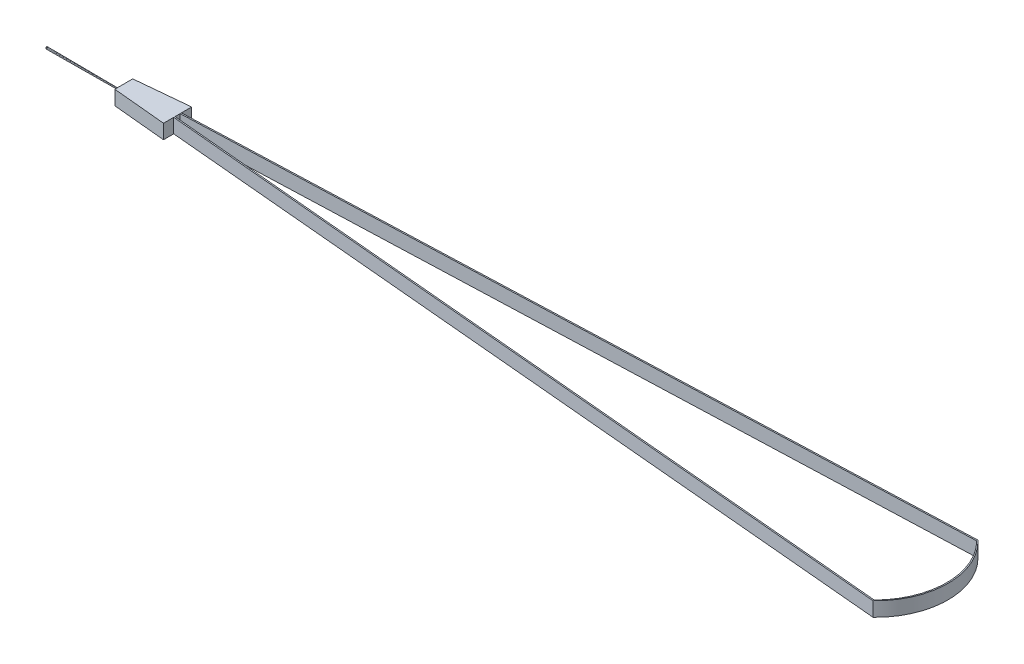
ISO-10303-21;
HEADER;
FILE_DESCRIPTION(('STEP AP214'),'2;1');
FILE_NAME('part.step','',(''),(''),'','','');
FILE_SCHEMA(('AUTOMOTIVE_DESIGN { 1 0 10303 214 1 1 1 1 }'));
ENDSEC;
DATA;
#1=APPLICATION_CONTEXT('core data for automotive mechanical design processes');
#2=APPLICATION_PROTOCOL_DEFINITION('international standard','automotive_design',2000,#1);
#3=PRODUCT_CONTEXT('',#1,'mechanical');
#4=PRODUCT('Part','Part','',(#3));
#5=PRODUCT_RELATED_PRODUCT_CATEGORY('part','',(#4));
#6=PRODUCT_DEFINITION_FORMATION('','',#4);
#7=PRODUCT_DEFINITION_CONTEXT('part definition',#1,'design');
#8=PRODUCT_DEFINITION('design','',#6,#7);
#9=PRODUCT_DEFINITION_SHAPE('','',#8);
#10=(LENGTH_UNIT() NAMED_UNIT(*) SI_UNIT(.MILLI.,.METRE.));
#11=(NAMED_UNIT(*) PLANE_ANGLE_UNIT() SI_UNIT($,.RADIAN.));
#12=(NAMED_UNIT(*) SI_UNIT($,.STERADIAN.) SOLID_ANGLE_UNIT());
#13=UNCERTAINTY_MEASURE_WITH_UNIT(LENGTH_MEASURE(1.E-05),#10,'distance_accuracy_value','');
#14=(GEOMETRIC_REPRESENTATION_CONTEXT(3) GLOBAL_UNCERTAINTY_ASSIGNED_CONTEXT((#13)) GLOBAL_UNIT_ASSIGNED_CONTEXT((#10,
#11,#12)) REPRESENTATION_CONTEXT('',''));
#15=CARTESIAN_POINT('',(0.,0.,0.));
#16=DIRECTION('',(0.,0.,1.));
#17=DIRECTION('',(1.,0.,0.));
#18=AXIS2_PLACEMENT_3D('',#15,#16,#17);
#19=CARTESIAN_POINT('',(0.221152593945903,0.,-2.46121703668856));
#20=DIRECTION('',(-0.0894944155506228,0.,0.995987324008319));
#21=DIRECTION('',(0.995987324008319,0.,0.0894944155506228));
#22=AXIS2_PLACEMENT_3D('',#19,#20,#21);
#23=PLANE('',#22);
#24=DIRECTION('',(0.995987324008319,0.,0.0894944155506228));
#25=VECTOR('',#24,1.);
#26=CARTESIAN_POINT('',(0.221152593945903,5.6,-2.46121703668856));
#27=LINE('',#26,#25);
#28=CARTESIAN_POINT('',(10.9064516129032,5.6,-1.50108976635671));
#29=VERTEX_POINT('',#28);
#30=CARTESIAN_POINT('',(310.906451612903,5.6,25.4554025684419));
#31=VERTEX_POINT('',#30);
#32=EDGE_CURVE('E215',#29,#31,#27,.T.);
#33=ORIENTED_EDGE('',*,*,#32,.F.);
#34=DIRECTION('',(0.,1.,0.));
#35=VECTOR('',#34,1.);
#36=CARTESIAN_POINT('',(10.9064516129032,0.,-1.50108976635671));
#37=LINE('',#36,#35);
#38=CARTESIAN_POINT('',(10.9064516129032,0.,-1.50108976635671));
#39=VERTEX_POINT('',#38);
#40=EDGE_CURVE('E13',#39,#29,#37,.T.);
#41=ORIENTED_EDGE('',*,*,#40,.F.);
#42=DIRECTION('',(0.995987324008319,0.,0.0894944155506228));
#43=VECTOR('',#42,1.);
#44=CARTESIAN_POINT('',(0.221152593945903,0.,-2.46121703668856));
#45=LINE('',#44,#43);
#46=CARTESIAN_POINT('',(310.906451612903,0.,25.4554025684419));
#47=VERTEX_POINT('',#46);
#48=EDGE_CURVE('E241',#39,#47,#45,.T.);
#49=ORIENTED_EDGE('',*,*,#48,.T.);
#50=DIRECTION('',(0.,1.,0.));
#51=VECTOR('',#50,1.);
#52=CARTESIAN_POINT('',(310.906451612903,0.,25.4554025684419));
#53=LINE('',#52,#51);
#54=EDGE_CURVE('E114',#47,#31,#53,.T.);
#55=ORIENTED_EDGE('',*,*,#54,.T.);
#56=EDGE_LOOP('',(#33,#41,#49,#55));
#57=FACE_BOUND('',#56,.T.);
#58=ADVANCED_FACE('F111',(#57),#23,.T.);
#59=CARTESIAN_POINT('',(10.9064516129032,0.,0.));
#60=DIRECTION('',(1.,0.,0.));
#61=DIRECTION('',(0.,0.,-1.));
#62=AXIS2_PLACEMENT_3D('',#59,#60,#61);
#63=PLANE('',#62);
#64=DIRECTION('',(0.,0.,-1.));
#65=VECTOR('',#64,1.);
#66=CARTESIAN_POINT('',(10.9064516129032,5.6,0.));
#67=LINE('',#66,#65);
#68=CARTESIAN_POINT('',(10.9064516129032,5.6,-2.00322580645161));
#69=VERTEX_POINT('',#68);
#70=EDGE_CURVE('E239',#29,#69,#67,.T.);
#71=ORIENTED_EDGE('',*,*,#70,.T.);
#72=DIRECTION('',(0.,1.,0.));
#73=VECTOR('',#72,1.);
#74=CARTESIAN_POINT('',(10.9064516129032,0.,-2.00322580645161));
#75=LINE('',#74,#73);
#76=CARTESIAN_POINT('',(10.9064516129032,0.,-2.00322580645161));
#77=VERTEX_POINT('',#76);
#78=EDGE_CURVE('E121',#77,#69,#75,.T.);
#79=ORIENTED_EDGE('',*,*,#78,.F.);
#80=DIRECTION('',(0.,0.,-1.));
#81=VECTOR('',#80,1.);
#82=CARTESIAN_POINT('',(10.9064516129032,0.,0.));
#83=LINE('',#82,#81);
#84=EDGE_CURVE('E201',#39,#77,#83,.T.);
#85=ORIENTED_EDGE('',*,*,#84,.F.);
#86=ORIENTED_EDGE('',*,*,#40,.T.);
#87=EDGE_LOOP('',(#71,#79,#85,#86));
#88=FACE_BOUND('',#87,.T.);
#89=ADVANCED_FACE('F261',(#88),#63,.F.);
#90=CARTESIAN_POINT('',(0.265938297905476,0.,-2.95940462037539));
#91=DIRECTION('',(0.0895014503086832,0.,-0.995986691875269));
#92=DIRECTION('',(-0.995986691875269,0.,-0.0895014503086832));
#93=AXIS2_PLACEMENT_3D('',#90,#91,#92);
#94=PLANE('',#93);
#95=DIRECTION('',(-0.995986691875269,0.,-0.0895014503086832));
#96=VECTOR('',#95,1.);
#97=CARTESIAN_POINT('',(0.265938297905476,5.6,-2.95940462037539));
#98=LINE('',#97,#96);
#99=CARTESIAN_POINT('',(310.906451612903,5.6,24.9554025684419));
#100=VERTEX_POINT('',#99);
#101=EDGE_CURVE('E186',#100,#69,#98,.T.);
#102=ORIENTED_EDGE('',*,*,#101,.F.);
#103=DIRECTION('',(0.,1.,0.));
#104=VECTOR('',#103,1.);
#105=CARTESIAN_POINT('',(310.906451612903,0.,24.9554025684419));
#106=LINE('',#105,#104);
#107=CARTESIAN_POINT('',(310.906451612903,0.,24.9554025684419));
#108=VERTEX_POINT('',#107);
#109=EDGE_CURVE('E181',#108,#100,#106,.T.);
#110=ORIENTED_EDGE('',*,*,#109,.F.);
#111=DIRECTION('',(-0.995986691875269,0.,-0.0895014503086832));
#112=VECTOR('',#111,1.);
#113=CARTESIAN_POINT('',(0.265938297905476,0.,-2.95940462037539));
#114=LINE('',#113,#112);
#115=EDGE_CURVE('E184',#108,#77,#114,.T.);
#116=ORIENTED_EDGE('',*,*,#115,.T.);
#117=ORIENTED_EDGE('',*,*,#78,.T.);
#118=EDGE_LOOP('',(#102,#110,#116,#117));
#119=FACE_BOUND('',#118,.T.);
#120=ADVANCED_FACE('F183',(#119),#94,.T.);
#121=CARTESIAN_POINT('',(290.906451612903,0.,4.95540256844191));
#122=DIRECTION('',(0.,1.,0.));
#123=DIRECTION('',(0.,0.,1.));
#124=AXIS2_PLACEMENT_3D('',#121,#122,#123);
#125=CYLINDRICAL_SURFACE('',#124,28.284271247462);
#126=CARTESIAN_POINT('',(290.906451612903,5.6,4.95540256844191));
#127=DIRECTION('',(0.,1.,0.));
#128=DIRECTION('',(0.,0.,1.));
#129=AXIS2_PLACEMENT_3D('',#126,#127,#128);
#130=CIRCLE('',#129,28.284271247462);
#131=CARTESIAN_POINT('',(310.906451612903,5.6,-15.0445974315581));
#132=VERTEX_POINT('',#131);
#133=EDGE_CURVE('E234',#132,#100,#130,.F.);
#134=ORIENTED_EDGE('',*,*,#133,.F.);
#135=DIRECTION('',(0.,1.,0.));
#136=VECTOR('',#135,1.);
#137=CARTESIAN_POINT('',(310.906451612903,0.,-15.0445974315581));
#138=LINE('',#137,#136);
#139=CARTESIAN_POINT('',(310.906451612903,0.,-15.0445974315581));
#140=VERTEX_POINT('',#139);
#141=EDGE_CURVE('E192',#140,#132,#138,.T.);
#142=ORIENTED_EDGE('',*,*,#141,.F.);
#143=CARTESIAN_POINT('',(290.906451612903,0.,4.95540256844191));
#144=DIRECTION('',(0.,1.,0.));
#145=DIRECTION('',(0.,0.,1.));
#146=AXIS2_PLACEMENT_3D('',#143,#144,#145);
#147=CIRCLE('',#146,28.284271247462);
#148=EDGE_CURVE('E199',#140,#108,#147,.F.);
#149=ORIENTED_EDGE('',*,*,#148,.T.);
#150=ORIENTED_EDGE('',*,*,#109,.T.);
#151=EDGE_LOOP('',(#134,#142,#149,#150));
#152=FACE_BOUND('',#151,.T.);
#153=ADVANCED_FACE('F204',(#152),#125,.F.);
#154=CARTESIAN_POINT('',(-0.132384065074162,0.,-3.59694618302151));
#155=DIRECTION('',(0.03677967007489,0.,0.999323399040162));
#156=DIRECTION('',(0.999323399040162,0.,-0.03677967007489));
#157=AXIS2_PLACEMENT_3D('',#154,#155,#156);
#158=PLANE('',#157);
#159=DIRECTION('',(0.999323399040162,0.,-0.03677967007489));
#160=VECTOR('',#159,1.);
#161=CARTESIAN_POINT('',(-0.132384065074162,5.6,-3.59694618302151));
#162=LINE('',#161,#160);
#163=CARTESIAN_POINT('',(10.9064516129032,5.6,-4.00322580645162));
#164=VERTEX_POINT('',#163);
#165=EDGE_CURVE('E230',#164,#132,#162,.T.);
#166=ORIENTED_EDGE('',*,*,#165,.F.);
#167=DIRECTION('',(0.,1.,0.));
#168=VECTOR('',#167,1.);
#169=CARTESIAN_POINT('',(10.9064516129032,0.,-4.00322580645162));
#170=LINE('',#169,#168);
#171=CARTESIAN_POINT('',(10.9064516129032,0.,-4.00322580645162));
#172=VERTEX_POINT('',#171);
#173=EDGE_CURVE('E247',#172,#164,#170,.T.);
#174=ORIENTED_EDGE('',*,*,#173,.F.);
#175=DIRECTION('',(0.999323399040162,0.,-0.03677967007489));
#176=VECTOR('',#175,1.);
#177=CARTESIAN_POINT('',(-0.132384065074162,0.,-3.59694618302151));
#178=LINE('',#177,#176);
#179=EDGE_CURVE('E206',#172,#140,#178,.T.);
#180=ORIENTED_EDGE('',*,*,#179,.T.);
#181=ORIENTED_EDGE('',*,*,#141,.T.);
#182=EDGE_LOOP('',(#166,#174,#180,#181));
#183=FACE_BOUND('',#182,.T.);
#184=ADVANCED_FACE('F281',(#183),#158,.T.);
#185=CARTESIAN_POINT('',(10.9064516129032,0.,0.));
#186=DIRECTION('',(1.,0.,0.));
#187=DIRECTION('',(0.,0.,-1.));
#188=AXIS2_PLACEMENT_3D('',#185,#186,#187);
#189=PLANE('',#188);
#190=DIRECTION('',(0.,0.,-1.));
#191=VECTOR('',#190,1.);
#192=CARTESIAN_POINT('',(10.9064516129032,5.6,0.));
#193=LINE('',#192,#191);
#194=CARTESIAN_POINT('',(10.9064516129032,5.6,-4.50322580645162));
#195=VERTEX_POINT('',#194);
#196=EDGE_CURVE('E227',#164,#195,#193,.T.);
#197=ORIENTED_EDGE('',*,*,#196,.T.);
#198=DIRECTION('',(0.,1.,0.));
#199=VECTOR('',#198,1.);
#200=CARTESIAN_POINT('',(10.9064516129032,0.,-4.50322580645162));
#201=LINE('',#200,#199);
#202=CARTESIAN_POINT('',(10.9064516129032,0.,-4.50322580645162));
#203=VERTEX_POINT('',#202);
#204=EDGE_CURVE('E250',#203,#195,#201,.T.);
#205=ORIENTED_EDGE('',*,*,#204,.F.);
#206=DIRECTION('',(0.,0.,-1.));
#207=VECTOR('',#206,1.);
#208=CARTESIAN_POINT('',(10.9064516129032,0.,0.));
#209=LINE('',#208,#207);
#210=EDGE_CURVE('E209',#172,#203,#209,.T.);
#211=ORIENTED_EDGE('',*,*,#210,.F.);
#212=ORIENTED_EDGE('',*,*,#173,.T.);
#213=EDGE_LOOP('',(#197,#205,#211,#212));
#214=FACE_BOUND('',#213,.T.);
#215=ADVANCED_FACE('F275',(#214),#189,.F.);
#216=CARTESIAN_POINT('',(-0.15076145753157,0.,-4.0962698109561));
#217=DIRECTION('',(0.03677967007489,0.,0.999323399040162));
#218=DIRECTION('',(0.999323399040162,0.,-0.03677967007489));
#219=AXIS2_PLACEMENT_3D('',#216,#217,#218);
#220=PLANE('',#219);
#221=DIRECTION('',(0.999323399040162,0.,-0.03677967007489));
#222=VECTOR('',#221,1.);
#223=CARTESIAN_POINT('',(-0.15076145753157,5.6,-4.0962698109561));
#224=LINE('',#223,#222);
#225=CARTESIAN_POINT('',(310.906451612903,5.6,-15.5445974315581));
#226=VERTEX_POINT('',#225);
#227=EDGE_CURVE('E223',#195,#226,#224,.T.);
#228=ORIENTED_EDGE('',*,*,#227,.T.);
#229=DIRECTION('',(0.,1.,0.));
#230=VECTOR('',#229,1.);
#231=CARTESIAN_POINT('',(310.906451612903,0.,-15.5445974315581));
#232=LINE('',#231,#230);
#233=CARTESIAN_POINT('',(310.906451612903,0.,-15.5445974315581));
#234=VERTEX_POINT('',#233);
#235=EDGE_CURVE('E253',#234,#226,#232,.T.);
#236=ORIENTED_EDGE('',*,*,#235,.F.);
#237=DIRECTION('',(0.999323399040162,0.,-0.03677967007489));
#238=VECTOR('',#237,1.);
#239=CARTESIAN_POINT('',(-0.15076145753157,0.,-4.0962698109561));
#240=LINE('',#239,#238);
#241=EDGE_CURVE('E266',#203,#234,#240,.T.);
#242=ORIENTED_EDGE('',*,*,#241,.F.);
#243=ORIENTED_EDGE('',*,*,#204,.T.);
#244=EDGE_LOOP('',(#228,#236,#242,#243));
#245=FACE_BOUND('',#244,.T.);
#246=ADVANCED_FACE('F278',(#245),#220,.F.);
#247=CARTESIAN_POINT('',(291.377991653852,0.,4.95540256844191));
#248=DIRECTION('',(0.,1.,0.));
#249=DIRECTION('',(0.,0.,1.));
#250=AXIS2_PLACEMENT_3D('',#247,#248,#249);
#251=CYLINDRICAL_SURFACE('',#250,28.3127312065134);
#252=CARTESIAN_POINT('',(291.377991653852,5.6,4.95540256844191));
#253=DIRECTION('',(0.,1.,0.));
#254=DIRECTION('',(0.,0.,1.));
#255=AXIS2_PLACEMENT_3D('',#252,#253,#254);
#256=CIRCLE('',#255,28.3127312065134);
#257=EDGE_CURVE('E219',#31,#226,#256,.T.);
#258=ORIENTED_EDGE('',*,*,#257,.F.);
#259=ORIENTED_EDGE('',*,*,#54,.F.);
#260=CARTESIAN_POINT('',(291.377991653852,0.,4.95540256844191));
#261=DIRECTION('',(0.,1.,0.));
#262=DIRECTION('',(0.,0.,1.));
#263=AXIS2_PLACEMENT_3D('',#260,#261,#262);
#264=CIRCLE('',#263,28.3127312065134);
#265=EDGE_CURVE('E262',#47,#234,#264,.T.);
#266=ORIENTED_EDGE('',*,*,#265,.T.);
#267=ORIENTED_EDGE('',*,*,#235,.T.);
#268=EDGE_LOOP('',(#258,#259,#266,#267));
#269=FACE_BOUND('',#268,.T.);
#270=ADVANCED_FACE('F257',(#269),#251,.T.);
#271=CARTESIAN_POINT('',(0.,0.,0.));
#272=DIRECTION('',(0.,1.,0.));
#273=DIRECTION('',(0.,0.,1.));
#274=AXIS2_PLACEMENT_3D('',#271,#272,#273);
#275=PLANE('',#274);
#276=ORIENTED_EDGE('',*,*,#48,.F.);
#277=ORIENTED_EDGE('',*,*,#84,.T.);
#278=ORIENTED_EDGE('',*,*,#115,.F.);
#279=ORIENTED_EDGE('',*,*,#148,.F.);
#280=ORIENTED_EDGE('',*,*,#179,.F.);
#281=ORIENTED_EDGE('',*,*,#210,.T.);
#282=ORIENTED_EDGE('',*,*,#241,.T.);
#283=ORIENTED_EDGE('',*,*,#265,.F.);
#284=EDGE_LOOP('',(#276,#277,#278,#279,#280,#281,#282,#283));
#285=FACE_BOUND('',#284,.T.);
#286=ADVANCED_FACE('F197',(#285),#275,.F.);
#287=CARTESIAN_POINT('',(0.,5.6,0.));
#288=DIRECTION('',(0.,1.,0.));
#289=DIRECTION('',(0.,0.,1.));
#290=AXIS2_PLACEMENT_3D('',#287,#288,#289);
#291=PLANE('',#290);
#292=ORIENTED_EDGE('',*,*,#32,.T.);
#293=ORIENTED_EDGE('',*,*,#257,.T.);
#294=ORIENTED_EDGE('',*,*,#227,.F.);
#295=ORIENTED_EDGE('',*,*,#196,.F.);
#296=ORIENTED_EDGE('',*,*,#165,.T.);
#297=ORIENTED_EDGE('',*,*,#133,.T.);
#298=ORIENTED_EDGE('',*,*,#101,.T.);
#299=ORIENTED_EDGE('',*,*,#70,.F.);
#300=EDGE_LOOP('',(#292,#293,#294,#295,#296,#297,#298,#299));
#301=FACE_BOUND('',#300,.T.);
#302=ADVANCED_FACE('F260',(#301),#291,.T.);
#303=CLOSED_SHELL('',(#58,#89,#120,#153,#184,#215,#246,#270,#286,#302));
#304=MANIFOLD_SOLID_BREP('B2',#303);
#305=CARTESIAN_POINT('',(10.9064516129032,5.6,-8.50322580645162));
#306=DIRECTION('',(-1.,0.,0.));
#307=DIRECTION('',(0.,0.,1.));
#308=AXIS2_PLACEMENT_3D('',#305,#306,#307);
#309=PLANE('',#308);
#310=DIRECTION('',(0.,-1.,0.));
#311=VECTOR('',#310,1.);
#312=CARTESIAN_POINT('',(10.9064516129032,5.6,-8.50322580645162));
#313=LINE('',#312,#311);
#314=CARTESIAN_POINT('',(10.9064516129032,5.6,-8.50322580645162));
#315=VERTEX_POINT('',#314);
#316=CARTESIAN_POINT('',(10.9064516129032,0.,-8.50322580645162));
#317=VERTEX_POINT('',#316);
#318=EDGE_CURVE('E513',#315,#317,#313,.T.);
#319=ORIENTED_EDGE('',*,*,#318,.F.);
#320=DIRECTION('',(0.,0.,-1.));
#321=VECTOR('',#320,1.);
#322=CARTESIAN_POINT('',(10.9064516129032,5.6,-8.50322580645162));
#323=LINE('',#322,#321);
#324=CARTESIAN_POINT('',(10.9064516129032,5.6,2.49677419354839));
#325=VERTEX_POINT('',#324);
#326=EDGE_CURVE('E505',#325,#315,#323,.T.);
#327=ORIENTED_EDGE('',*,*,#326,.F.);
#328=DIRECTION('',(0.,-1.,0.));
#329=VECTOR('',#328,1.);
#330=CARTESIAN_POINT('',(10.9064516129032,5.6,2.49677419354839));
#331=LINE('',#330,#329);
#332=CARTESIAN_POINT('',(10.9064516129032,0.,2.49677419354839));
#333=VERTEX_POINT('',#332);
#334=EDGE_CURVE('E571',#325,#333,#331,.T.);
#335=ORIENTED_EDGE('',*,*,#334,.T.);
#336=DIRECTION('',(0.,0.,-1.));
#337=VECTOR('',#336,1.);
#338=CARTESIAN_POINT('',(10.9064516129032,0.,-8.50322580645162));
#339=LINE('',#338,#337);
#340=EDGE_CURVE('E492',#333,#317,#339,.T.);
#341=ORIENTED_EDGE('',*,*,#340,.T.);
#342=EDGE_LOOP('',(#319,#327,#335,#341));
#343=FACE_BOUND('',#342,.T.);
#344=ADVANCED_FACE('F398',(#343),#309,.F.);
#345=CARTESIAN_POINT('',(-10.0935483870968,5.6,-6.50322580645162));
#346=DIRECTION('',(1.,0.,0.));
#347=DIRECTION('',(0.,0.,-1.));
#348=AXIS2_PLACEMENT_3D('',#345,#346,#347);
#349=PLANE('',#348);
#350=DIRECTION('',(0.,0.,1.));
#351=VECTOR('',#350,1.);
#352=CARTESIAN_POINT('',(-10.0935483870968,0.,-6.50322580645162));
#353=LINE('',#352,#351);
#354=CARTESIAN_POINT('',(-10.0935483870968,0.,-6.50322580645162));
#355=VERTEX_POINT('',#354);
#356=CARTESIAN_POINT('',(-10.0935483870968,0.,0.496774193548385));
#357=VERTEX_POINT('',#356);
#358=EDGE_CURVE('E497',#355,#357,#353,.T.);
#359=ORIENTED_EDGE('',*,*,#358,.T.);
#360=DIRECTION('',(0.,-1.,0.));
#361=VECTOR('',#360,1.);
#362=CARTESIAN_POINT('',(-10.0935483870968,5.6,0.496774193548385));
#363=LINE('',#362,#361);
#364=CARTESIAN_POINT('',(-10.0935483870968,5.6,0.496774193548385));
#365=VERTEX_POINT('',#364);
#366=EDGE_CURVE('E484',#365,#357,#363,.T.);
#367=ORIENTED_EDGE('',*,*,#366,.F.);
#368=DIRECTION('',(0.,0.,1.));
#369=VECTOR('',#368,1.);
#370=CARTESIAN_POINT('',(-10.0935483870968,5.6,-6.50322580645162));
#371=LINE('',#370,#369);
#372=CARTESIAN_POINT('',(-10.0935483870968,5.6,-6.50322580645162));
#373=VERTEX_POINT('',#372);
#374=EDGE_CURVE('E511',#373,#365,#371,.T.);
#375=ORIENTED_EDGE('',*,*,#374,.F.);
#376=DIRECTION('',(0.,-1.,0.));
#377=VECTOR('',#376,1.);
#378=CARTESIAN_POINT('',(-10.0935483870968,5.6,-6.50322580645162));
#379=LINE('',#378,#377);
#380=EDGE_CURVE('E500',#373,#355,#379,.T.);
#381=ORIENTED_EDGE('',*,*,#380,.T.);
#382=EDGE_LOOP('',(#359,#367,#375,#381));
#383=FACE_BOUND('',#382,.T.);
#384=DIRECTION('',(0.,0.,-1.));
#385=VECTOR('',#384,1.);
#386=CARTESIAN_POINT('',(-10.0935483870968,2.55,-2.75322580645162));
#387=LINE('',#386,#385);
#388=CARTESIAN_POINT('',(-10.0935483870968,2.55,-3.00322580645162));
#389=VERTEX_POINT('',#388);
#390=CARTESIAN_POINT('',(-10.0935483870968,2.55,-3.02822580645162));
#391=VERTEX_POINT('',#390);
#392=EDGE_CURVE('E516',#389,#391,#387,.T.);
#393=ORIENTED_EDGE('',*,*,#392,.T.);
#394=DIRECTION('',(0.,1.,0.));
#395=VECTOR('',#394,1.);
#396=CARTESIAN_POINT('',(-10.0935483870968,-96.95,-3.02822580645162));
#397=LINE('',#396,#395);
#398=CARTESIAN_POINT('',(-10.0935483870968,3.05,-3.02822580645162));
#399=VERTEX_POINT('',#398);
#400=EDGE_CURVE('E529',#391,#399,#397,.T.);
#401=ORIENTED_EDGE('',*,*,#400,.T.);
#402=DIRECTION('',(0.,0.,-1.));
#403=VECTOR('',#402,1.);
#404=CARTESIAN_POINT('',(-10.0935483870968,3.05,-2.75322580645162));
#405=LINE('',#404,#403);
#406=CARTESIAN_POINT('',(-10.0935483870968,3.05,-3.00322580645162));
#407=VERTEX_POINT('',#406);
#408=EDGE_CURVE('E467',#407,#399,#405,.T.);
#409=ORIENTED_EDGE('',*,*,#408,.F.);
#410=CARTESIAN_POINT('',(-10.0935483870968,3.05,-2.97822580645162));
#411=VERTEX_POINT('',#410);
#412=EDGE_CURVE('E472',#411,#407,#405,.T.);
#413=ORIENTED_EDGE('',*,*,#412,.F.);
#414=DIRECTION('',(0.,1.,0.));
#415=VECTOR('',#414,1.);
#416=CARTESIAN_POINT('',(-10.0935483870968,-96.95,-2.97822580645162));
#417=LINE('',#416,#415);
#418=CARTESIAN_POINT('',(-10.0935483870968,2.55,-2.97822580645162));
#419=VERTEX_POINT('',#418);
#420=EDGE_CURVE('E109',#419,#411,#417,.T.);
#421=ORIENTED_EDGE('',*,*,#420,.F.);
#422=EDGE_CURVE('E519',#419,#389,#387,.T.);
#423=ORIENTED_EDGE('',*,*,#422,.T.);
#424=EDGE_LOOP('',(#393,#401,#409,#413,#421,#423));
#425=FACE_BOUND('',#424,.T.);
#426=ADVANCED_FACE('F557',(#383,#425),#349,.F.);
#427=CARTESIAN_POINT('',(-110.093548387097,2.55,-2.75322580645159));
#428=DIRECTION('',(0.,-1.,0.));
#429=DIRECTION('',(0.,0.,-1.));
#430=AXIS2_PLACEMENT_3D('',#427,#428,#429);
#431=PLANE('',#430);
#432=DIRECTION('',(-0.999965279586122,0.,-0.00833304399655007));
#433=VECTOR('',#432,1.);
#434=CARTESIAN_POINT('',(-110.084312917338,2.55,-3.86148217753686));
#435=LINE('',#434,#433);
#436=CARTESIAN_POINT('',(-37.093548387099,2.55,-3.25322580645161));
#437=VERTEX_POINT('',#436);
#438=EDGE_CURVE('E525',#391,#437,#435,.T.);
#439=ORIENTED_EDGE('',*,*,#438,.F.);
#440=ORIENTED_EDGE('',*,*,#392,.F.);
#441=DIRECTION('',(0.999965279586122,0.,0.00833304399655007));
#442=VECTOR('',#441,1.);
#443=CARTESIAN_POINT('',(-110.084521236204,2.55,-3.83648391352742));
#444=LINE('',#443,#442);
#445=CARTESIAN_POINT('',(-40.0935483870968,2.55,-3.25322580645161));
#446=VERTEX_POINT('',#445);
#447=EDGE_CURVE('E504',#446,#389,#444,.T.);
#448=ORIENTED_EDGE('',*,*,#447,.F.);
#449=DIRECTION('',(1.,0.,0.));
#450=VECTOR('',#449,1.);
#451=CARTESIAN_POINT('',(-110.093548387097,2.55,-3.25322580645159));
#452=LINE('',#451,#450);
#453=EDGE_CURVE('E402',#446,#437,#452,.T.);
#454=ORIENTED_EDGE('',*,*,#453,.T.);
#455=EDGE_LOOP('',(#439,#440,#448,#454));
#456=FACE_BOUND('',#455,.T.);
#457=ADVANCED_FACE('F400',(#456),#431,.T.);
#458=DIRECTION('',(-0.999965279586122,0.,0.00833304399655127));
#459=VECTOR('',#458,1.);
#460=CARTESIAN_POINT('',(-110.088687613539,2.55,-2.16993297956457));
#461=LINE('',#460,#459);
#462=CARTESIAN_POINT('',(-40.0935483870968,2.55,-2.75322580645161));
#463=VERTEX_POINT('',#462);
#464=EDGE_CURVE('E520',#389,#463,#461,.T.);
#465=ORIENTED_EDGE('',*,*,#464,.F.);
#466=ORIENTED_EDGE('',*,*,#422,.F.);
#467=DIRECTION('',(-0.999965279586122,0.,0.00833304399655185));
#468=VECTOR('',#467,1.);
#469=CARTESIAN_POINT('',(-110.088479294673,2.55,-2.14493471555507));
#470=LINE('',#469,#468);
#471=CARTESIAN_POINT('',(-37.0935483870948,2.55,-2.75322580645161));
#472=VERTEX_POINT('',#471);
#473=EDGE_CURVE('E416',#419,#472,#470,.T.);
#474=ORIENTED_EDGE('',*,*,#473,.T.);
#475=DIRECTION('',(1.,0.,0.));
#476=VECTOR('',#475,1.);
#477=CARTESIAN_POINT('',(-110.093548387097,2.55,-2.75322580645159));
#478=LINE('',#477,#476);
#479=EDGE_CURVE('E466',#463,#472,#478,.T.);
#480=ORIENTED_EDGE('',*,*,#479,.F.);
#481=EDGE_LOOP('',(#465,#466,#474,#480));
#482=FACE_BOUND('',#481,.T.);
#483=ADVANCED_FACE('F560',(#482),#431,.T.);
#484=CARTESIAN_POINT('',(-110.093548387097,2.55,-2.75322580645159));
#485=DIRECTION('',(0.,0.,-1.));
#486=DIRECTION('',(-1.,0.,0.));
#487=AXIS2_PLACEMENT_3D('',#484,#485,#486);
#488=PLANE('',#487);
#489=DIRECTION('',(1.,0.,0.));
#490=VECTOR('',#489,1.);
#491=CARTESIAN_POINT('',(-110.093548387097,3.05,-2.75322580645159));
#492=LINE('',#491,#490);
#493=CARTESIAN_POINT('',(-40.0935483870968,3.05,-2.75322580645161));
#494=VERTEX_POINT('',#493);
#495=CARTESIAN_POINT('',(-37.0935483870948,3.05,-2.75322580645161));
#496=VERTEX_POINT('',#495);
#497=EDGE_CURVE('E457',#494,#496,#492,.T.);
#498=ORIENTED_EDGE('',*,*,#497,.F.);
#499=DIRECTION('',(0.,1.,0.));
#500=VECTOR('',#499,1.);
#501=CARTESIAN_POINT('',(-40.0935483870968,-96.95,-2.75322580645161));
#502=LINE('',#501,#500);
#503=EDGE_CURVE('E522',#463,#494,#502,.T.);
#504=ORIENTED_EDGE('',*,*,#503,.F.);
#505=ORIENTED_EDGE('',*,*,#479,.T.);
#506=DIRECTION('',(0.,1.,0.));
#507=VECTOR('',#506,1.);
#508=CARTESIAN_POINT('',(-37.0935483870948,-96.95,-2.75322580645161));
#509=LINE('',#508,#507);
#510=EDGE_CURVE('E451',#472,#496,#509,.T.);
#511=ORIENTED_EDGE('',*,*,#510,.T.);
#512=EDGE_LOOP('',(#498,#504,#505,#511));
#513=FACE_BOUND('',#512,.T.);
#514=ADVANCED_FACE('F462',(#513),#488,.F.);
#515=CARTESIAN_POINT('',(-110.093548387097,3.05,-2.75322580645159));
#516=DIRECTION('',(0.,-1.,0.));
#517=DIRECTION('',(0.,0.,-1.));
#518=AXIS2_PLACEMENT_3D('',#515,#516,#517);
#519=PLANE('',#518);
#520=ORIENTED_EDGE('',*,*,#408,.T.);
#521=DIRECTION('',(0.999965279586122,0.,0.00833304399655008));
#522=VECTOR('',#521,1.);
#523=CARTESIAN_POINT('',(0.0245325705428136,3.05,-2.94390846513796));
#524=LINE('',#523,#522);
#525=CARTESIAN_POINT('',(-37.0935483870992,3.05,-3.25322580645161));
#526=VERTEX_POINT('',#525);
#527=EDGE_CURVE('E408',#526,#399,#524,.T.);
#528=ORIENTED_EDGE('',*,*,#527,.F.);
#529=DIRECTION('',(1.,0.,0.));
#530=VECTOR('',#529,1.);
#531=CARTESIAN_POINT('',(-110.093548387097,3.05,-3.25322580645159));
#532=LINE('',#531,#530);
#533=CARTESIAN_POINT('',(-40.0935483870965,3.05,-3.25322580645161));
#534=VERTEX_POINT('',#533);
#535=EDGE_CURVE('E456',#534,#526,#532,.T.);
#536=ORIENTED_EDGE('',*,*,#535,.F.);
#537=DIRECTION('',(-0.999965279586122,0.,-0.00833304399655008));
#538=VECTOR('',#537,1.);
#539=CARTESIAN_POINT('',(0.0243242516760682,3.05,-2.91891020112852));
#540=LINE('',#539,#538);
#541=EDGE_CURVE('E535',#407,#534,#540,.T.);
#542=ORIENTED_EDGE('',*,*,#541,.F.);
#543=EDGE_LOOP('',(#520,#528,#536,#542));
#544=FACE_BOUND('',#543,.T.);
#545=ADVANCED_FACE('F565',(#544),#519,.F.);
#546=ORIENTED_EDGE('',*,*,#412,.T.);
#547=DIRECTION('',(0.999965279586122,0.,-0.00833304399655128));
#548=VECTOR('',#547,1.);
#549=CARTESIAN_POINT('',(-0.0257260360503647,3.05,-3.08712432604367));
#550=LINE('',#549,#548);
#551=EDGE_CURVE('E471',#494,#407,#550,.T.);
#552=ORIENTED_EDGE('',*,*,#551,.F.);
#553=ORIENTED_EDGE('',*,*,#497,.T.);
#554=DIRECTION('',(0.999965279586122,0.,-0.00833304399655185));
#555=VECTOR('',#554,1.);
#556=CARTESIAN_POINT('',(-0.0255177171836212,3.05,-3.06212606203424));
#557=LINE('',#556,#555);
#558=EDGE_CURVE('E448',#496,#411,#557,.T.);
#559=ORIENTED_EDGE('',*,*,#558,.T.);
#560=EDGE_LOOP('',(#546,#552,#553,#559));
#561=FACE_BOUND('',#560,.T.);
#562=ADVANCED_FACE('F469',(#561),#519,.F.);
#563=CARTESIAN_POINT('',(-110.093548387097,2.55,-3.25322580645159));
#564=DIRECTION('',(0.,0.,-1.));
#565=DIRECTION('',(-1.,0.,0.));
#566=AXIS2_PLACEMENT_3D('',#563,#564,#565);
#567=PLANE('',#566);
#568=DIRECTION('',(0.,1.,0.));
#569=VECTOR('',#568,1.);
#570=CARTESIAN_POINT('',(-37.093548387099,2.55,-3.25322580645161));
#571=LINE('',#570,#569);
#572=EDGE_CURVE('E528',#437,#526,#571,.T.);
#573=ORIENTED_EDGE('',*,*,#572,.F.);
#574=ORIENTED_EDGE('',*,*,#453,.F.);
#575=DIRECTION('',(0.,-1.,0.));
#576=VECTOR('',#575,1.);
#577=CARTESIAN_POINT('',(-40.0935483870993,2.55,-3.25322580645161));
#578=LINE('',#577,#576);
#579=EDGE_CURVE('E523',#534,#446,#578,.T.);
#580=ORIENTED_EDGE('',*,*,#579,.F.);
#581=ORIENTED_EDGE('',*,*,#535,.T.);
#582=EDGE_LOOP('',(#573,#574,#580,#581));
#583=FACE_BOUND('',#582,.T.);
#584=ADVANCED_FACE('F550',(#583),#567,.T.);
#585=CARTESIAN_POINT('',(10.9064516129032,5.6,2.49677419354839));
#586=DIRECTION('',(0.0948090926279954,0.,-0.995495472593952));
#587=DIRECTION('',(-0.995495472593952,0.,-0.0948090926279954));
#588=AXIS2_PLACEMENT_3D('',#585,#586,#587);
#589=PLANE('',#588);
#590=DIRECTION('',(0.995495472593952,0.,0.0948090926279954));
#591=VECTOR('',#590,1.);
#592=CARTESIAN_POINT('',(10.9064516129032,0.,2.49677419354839));
#593=LINE('',#592,#591);
#594=EDGE_CURVE('E478',#357,#333,#593,.T.);
#595=ORIENTED_EDGE('',*,*,#594,.T.);
#596=ORIENTED_EDGE('',*,*,#334,.F.);
#597=DIRECTION('',(0.995495472593952,0.,0.0948090926279954));
#598=VECTOR('',#597,1.);
#599=CARTESIAN_POINT('',(10.9064516129032,5.6,2.49677419354839));
#600=LINE('',#599,#598);
#601=EDGE_CURVE('E508',#365,#325,#600,.T.);
#602=ORIENTED_EDGE('',*,*,#601,.F.);
#603=ORIENTED_EDGE('',*,*,#366,.T.);
#604=EDGE_LOOP('',(#595,#596,#602,#603));
#605=FACE_BOUND('',#604,.T.);
#606=ADVANCED_FACE('F608',(#605),#589,.F.);
#607=CARTESIAN_POINT('',(-10.0935483870968,5.6,-6.50322580645162));
#608=DIRECTION('',(0.0948090926279954,0.,0.995495472593952));
#609=DIRECTION('',(0.995495472593952,0.,-0.0948090926279954));
#610=AXIS2_PLACEMENT_3D('',#607,#608,#609);
#611=PLANE('',#610);
#612=DIRECTION('',(-0.995495472593952,0.,0.0948090926279954));
#613=VECTOR('',#612,1.);
#614=CARTESIAN_POINT('',(-10.0935483870968,0.,-6.50322580645162));
#615=LINE('',#614,#613);
#616=EDGE_CURVE('E573',#317,#355,#615,.T.);
#617=ORIENTED_EDGE('',*,*,#616,.T.);
#618=ORIENTED_EDGE('',*,*,#380,.F.);
#619=DIRECTION('',(-0.995495472593952,0.,0.0948090926279954));
#620=VECTOR('',#619,1.);
#621=CARTESIAN_POINT('',(-10.0935483870968,5.6,-6.50322580645162));
#622=LINE('',#621,#620);
#623=EDGE_CURVE('E501',#315,#373,#622,.T.);
#624=ORIENTED_EDGE('',*,*,#623,.F.);
#625=ORIENTED_EDGE('',*,*,#318,.T.);
#626=EDGE_LOOP('',(#617,#618,#624,#625));
#627=FACE_BOUND('',#626,.T.);
#628=ADVANCED_FACE('F582',(#627),#611,.F.);
#629=CARTESIAN_POINT('',(0.,5.6,0.));
#630=DIRECTION('',(0.,-1.,0.));
#631=DIRECTION('',(0.,0.,-1.));
#632=AXIS2_PLACEMENT_3D('',#629,#630,#631);
#633=PLANE('',#632);
#634=ORIENTED_EDGE('',*,*,#326,.T.);
#635=ORIENTED_EDGE('',*,*,#623,.T.);
#636=ORIENTED_EDGE('',*,*,#374,.T.);
#637=ORIENTED_EDGE('',*,*,#601,.T.);
#638=EDGE_LOOP('',(#634,#635,#636,#637));
#639=FACE_BOUND('',#638,.T.);
#640=ADVANCED_FACE('F598',(#639),#633,.F.);
#641=CARTESIAN_POINT('',(0.,0.,0.));
#642=DIRECTION('',(0.,-1.,0.));
#643=DIRECTION('',(0.,0.,-1.));
#644=AXIS2_PLACEMENT_3D('',#641,#642,#643);
#645=PLANE('',#644);
#646=ORIENTED_EDGE('',*,*,#616,.F.);
#647=ORIENTED_EDGE('',*,*,#340,.F.);
#648=ORIENTED_EDGE('',*,*,#594,.F.);
#649=ORIENTED_EDGE('',*,*,#358,.F.);
#650=EDGE_LOOP('',(#646,#647,#648,#649));
#651=FACE_BOUND('',#650,.T.);
#652=ADVANCED_FACE('F607',(#651),#645,.T.);
#653=CARTESIAN_POINT('',(0.0243242516760682,-96.95,-2.91891020112852));
#654=DIRECTION('',(0.00833304399655007,0.,-0.999965279586122));
#655=DIRECTION('',(-0.999965279586122,0.,-0.00833304399655007));
#656=AXIS2_PLACEMENT_3D('',#653,#654,#655);
#657=PLANE('',#656);
#658=ORIENTED_EDGE('',*,*,#447,.T.);
#659=DIRECTION('',(0.,1.,0.));
#660=VECTOR('',#659,1.);
#661=CARTESIAN_POINT('',(-10.0935483870968,-96.95,-3.00322580645162));
#662=LINE('',#661,#660);
#663=EDGE_CURVE('E531',#389,#407,#662,.T.);
#664=ORIENTED_EDGE('',*,*,#663,.T.);
#665=ORIENTED_EDGE('',*,*,#541,.T.);
#666=ORIENTED_EDGE('',*,*,#579,.T.);
#667=EDGE_LOOP('',(#658,#664,#665,#666));
#668=FACE_BOUND('',#667,.T.);
#669=ADVANCED_FACE('F544',(#668),#657,.F.);
#670=CARTESIAN_POINT('',(-0.0257260360503647,-96.95,-3.08712432604367));
#671=DIRECTION('',(0.00833304399655127,0.,0.999965279586122));
#672=DIRECTION('',(0.999965279586122,0.,-0.00833304399655127));
#673=AXIS2_PLACEMENT_3D('',#670,#671,#672);
#674=PLANE('',#673);
#675=ORIENTED_EDGE('',*,*,#464,.T.);
#676=ORIENTED_EDGE('',*,*,#503,.T.);
#677=ORIENTED_EDGE('',*,*,#551,.T.);
#678=ORIENTED_EDGE('',*,*,#663,.F.);
#679=EDGE_LOOP('',(#675,#676,#677,#678));
#680=FACE_BOUND('',#679,.T.);
#681=ADVANCED_FACE('F562',(#680),#674,.F.);
#682=CARTESIAN_POINT('',(0.0245325705428136,-96.95,-2.94390846513796));
#683=DIRECTION('',(-0.00833304399655007,0.,0.999965279586122));
#684=DIRECTION('',(0.999965279586122,0.,0.00833304399655007));
#685=AXIS2_PLACEMENT_3D('',#682,#683,#684);
#686=PLANE('',#685);
#687=ORIENTED_EDGE('',*,*,#438,.T.);
#688=ORIENTED_EDGE('',*,*,#572,.T.);
#689=ORIENTED_EDGE('',*,*,#527,.T.);
#690=ORIENTED_EDGE('',*,*,#400,.F.);
#691=EDGE_LOOP('',(#687,#688,#689,#690));
#692=FACE_BOUND('',#691,.T.);
#693=ADVANCED_FACE('F568',(#692),#686,.F.);
#694=CARTESIAN_POINT('',(-0.0255177171836212,-96.95,-3.06212606203424));
#695=DIRECTION('',(0.00833304399655185,0.,0.999965279586122));
#696=DIRECTION('',(0.999965279586122,0.,-0.00833304399655185));
#697=AXIS2_PLACEMENT_3D('',#694,#695,#696);
#698=PLANE('',#697);
#699=ORIENTED_EDGE('',*,*,#420,.T.);
#700=ORIENTED_EDGE('',*,*,#558,.F.);
#701=ORIENTED_EDGE('',*,*,#510,.F.);
#702=ORIENTED_EDGE('',*,*,#473,.F.);
#703=EDGE_LOOP('',(#699,#700,#701,#702));
#704=FACE_BOUND('',#703,.T.);
#705=ADVANCED_FACE('F450',(#704),#698,.T.);
#706=CLOSED_SHELL('',(#344,#426,#457,#483,#514,#545,#562,#584,#606,#628,#640,#652,#669,#681,
#693,#705));
#707=MANIFOLD_SOLID_BREP('B7',#706);
#708=CARTESIAN_POINT('',(-110.093548387097,2.55,-3.25322580645159));
#709=DIRECTION('',(0.,0.,-1.));
#710=DIRECTION('',(-1.,0.,0.));
#711=AXIS2_PLACEMENT_3D('',#708,#709,#710);
#712=PLANE('',#711);
#713=DIRECTION('',(1.,0.,0.));
#714=VECTOR('',#713,1.);
#715=CARTESIAN_POINT('',(-110.093548387097,3.05,-3.25322580645159));
#716=LINE('',#715,#714);
#717=CARTESIAN_POINT('',(-40.1873149850912,3.05,-3.25322580645161));
#718=VERTEX_POINT('',#717);
#719=CARTESIAN_POINT('',(-40.0935483870968,3.05,-3.25322580645161));
#720=VERTEX_POINT('',#719);
#721=EDGE_CURVE('E838',#718,#720,#716,.T.);
#722=ORIENTED_EDGE('',*,*,#721,.T.);
#723=DIRECTION('',(0.,-1.,0.));
#724=VECTOR('',#723,1.);
#725=CARTESIAN_POINT('',(-40.0935483870993,2.55,-3.25322580645161));
#726=LINE('',#725,#724);
#727=CARTESIAN_POINT('',(-40.0935483870993,2.55,-3.25322580645161));
#728=VERTEX_POINT('',#727);
#729=EDGE_CURVE('E794',#720,#728,#726,.T.);
#730=ORIENTED_EDGE('',*,*,#729,.T.);
#731=DIRECTION('',(1.,0.,0.));
#732=VECTOR('',#731,1.);
#733=CARTESIAN_POINT('',(-110.093548387097,2.55,-3.25322580645159));
#734=LINE('',#733,#732);
#735=CARTESIAN_POINT('',(-40.1873149850912,2.55,-3.25322580645161));
#736=VERTEX_POINT('',#735);
#737=EDGE_CURVE('E841',#736,#728,#734,.T.);
#738=ORIENTED_EDGE('',*,*,#737,.F.);
#739=DIRECTION('',(0.,1.,0.));
#740=VECTOR('',#739,1.);
#741=CARTESIAN_POINT('',(-40.1873149850912,-96.95,-3.25322580645161));
#742=LINE('',#741,#740);
#743=EDGE_CURVE('E856',#736,#718,#742,.T.);
#744=ORIENTED_EDGE('',*,*,#743,.T.);
#745=EDGE_LOOP('',(#722,#730,#738,#744));
#746=FACE_BOUND('',#745,.T.);
#747=ADVANCED_FACE('F786',(#746),#712,.T.);
#748=CARTESIAN_POINT('',(-110.093548387097,3.05,-2.75322580645159));
#749=DIRECTION('',(0.,-1.,0.));
#750=DIRECTION('',(0.,0.,-1.));
#751=AXIS2_PLACEMENT_3D('',#748,#749,#750);
#752=PLANE('',#751);
#753=DIRECTION('',(1.,0.,0.));
#754=VECTOR('',#753,1.);
#755=CARTESIAN_POINT('',(-110.093548387097,3.05,-2.75322580645159));
#756=LINE('',#755,#754);
#757=CARTESIAN_POINT('',(-40.1873149850913,3.05,-2.75322580645161));
#758=VERTEX_POINT('',#757);
#759=CARTESIAN_POINT('',(-40.0935483870968,3.05,-2.75322580645161));
#760=VERTEX_POINT('',#759);
#761=EDGE_CURVE('E832',#758,#760,#756,.T.);
#762=ORIENTED_EDGE('',*,*,#761,.T.);
#763=CARTESIAN_POINT('',(-40.0703377797754,3.05,-3.00322580645159));
#764=DIRECTION('',(0.,1.,0.));
#765=DIRECTION('',(0.,0.,1.));
#766=AXIS2_PLACEMENT_3D('',#763,#764,#765);
#767=CIRCLE('',#766,0.251075152677886);
#768=EDGE_CURVE('E821',#720,#760,#767,.T.);
#769=ORIENTED_EDGE('',*,*,#768,.F.);
#770=ORIENTED_EDGE('',*,*,#721,.F.);
#771=CARTESIAN_POINT('',(-40.0704440770695,3.05,-3.00322580645159));
#772=DIRECTION('',(0.,1.,0.));
#773=DIRECTION('',(0.,0.,1.));
#774=AXIS2_PLACEMENT_3D('',#771,#772,#773);
#775=CIRCLE('',#774,0.275968855383787);
#776=EDGE_CURVE('E826',#718,#758,#775,.T.);
#777=ORIENTED_EDGE('',*,*,#776,.T.);
#778=EDGE_LOOP('',(#762,#769,#770,#777));
#779=FACE_BOUND('',#778,.T.);
#780=ADVANCED_FACE('F837',(#779),#752,.F.);
#781=CARTESIAN_POINT('',(-110.093548387097,2.55,-2.75322580645159));
#782=DIRECTION('',(0.,0.,-1.));
#783=DIRECTION('',(-1.,0.,0.));
#784=AXIS2_PLACEMENT_3D('',#781,#782,#783);
#785=PLANE('',#784);
#786=DIRECTION('',(0.,-1.,0.));
#787=VECTOR('',#786,1.);
#788=CARTESIAN_POINT('',(-40.0935483870968,2.55,-2.75322580645161));
#789=LINE('',#788,#787);
#790=CARTESIAN_POINT('',(-40.0935483870968,2.55,-2.75322580645161));
#791=VERTEX_POINT('',#790);
#792=EDGE_CURVE('E396',#760,#791,#789,.T.);
#793=ORIENTED_EDGE('',*,*,#792,.F.);
#794=ORIENTED_EDGE('',*,*,#761,.F.);
#795=DIRECTION('',(0.,1.,0.));
#796=VECTOR('',#795,1.);
#797=CARTESIAN_POINT('',(-40.1873149850913,-96.95,-2.75322580645161));
#798=LINE('',#797,#796);
#799=CARTESIAN_POINT('',(-40.1873149850913,2.55,-2.75322580645161));
#800=VERTEX_POINT('',#799);
#801=EDGE_CURVE('E854',#800,#758,#798,.T.);
#802=ORIENTED_EDGE('',*,*,#801,.F.);
#803=DIRECTION('',(1.,0.,0.));
#804=VECTOR('',#803,1.);
#805=CARTESIAN_POINT('',(-110.093548387097,2.55,-2.75322580645159));
#806=LINE('',#805,#804);
#807=EDGE_CURVE('E834',#800,#791,#806,.T.);
#808=ORIENTED_EDGE('',*,*,#807,.T.);
#809=EDGE_LOOP('',(#793,#794,#802,#808));
#810=FACE_BOUND('',#809,.T.);
#811=ADVANCED_FACE('F830',(#810),#785,.F.);
#812=CARTESIAN_POINT('',(-110.093548387097,2.55,-2.75322580645159));
#813=DIRECTION('',(0.,-1.,0.));
#814=DIRECTION('',(0.,0.,-1.));
#815=AXIS2_PLACEMENT_3D('',#812,#813,#814);
#816=PLANE('',#815);
#817=CARTESIAN_POINT('',(-40.0703377797754,2.55,-3.00322580645159));
#818=DIRECTION('',(0.,-1.,0.));
#819=DIRECTION('',(0.,0.,-1.));
#820=AXIS2_PLACEMENT_3D('',#817,#818,#819);
#821=CIRCLE('',#820,0.251075152677886);
#822=EDGE_CURVE('E846',#791,#728,#821,.T.);
#823=ORIENTED_EDGE('',*,*,#822,.F.);
#824=ORIENTED_EDGE('',*,*,#807,.F.);
#825=CARTESIAN_POINT('',(-40.0704440770695,2.55,-3.00322580645159));
#826=DIRECTION('',(0.,-1.,0.));
#827=DIRECTION('',(0.,0.,-1.));
#828=AXIS2_PLACEMENT_3D('',#825,#826,#827);
#829=CIRCLE('',#828,0.275968855383787);
#830=EDGE_CURVE('E852',#800,#736,#829,.T.);
#831=ORIENTED_EDGE('',*,*,#830,.T.);
#832=ORIENTED_EDGE('',*,*,#737,.T.);
#833=EDGE_LOOP('',(#823,#824,#831,#832));
#834=FACE_BOUND('',#833,.T.);
#835=ADVANCED_FACE('F788',(#834),#816,.T.);
#836=CARTESIAN_POINT('',(-40.0704440770695,-96.95,-3.00322580645159));
#837=DIRECTION('',(0.,1.,0.));
#838=DIRECTION('',(0.,0.,1.));
#839=AXIS2_PLACEMENT_3D('',#836,#837,#838);
#840=CYLINDRICAL_SURFACE('',#839,0.275968855383787);
#841=ORIENTED_EDGE('',*,*,#801,.T.);
#842=ORIENTED_EDGE('',*,*,#776,.F.);
#843=ORIENTED_EDGE('',*,*,#743,.F.);
#844=ORIENTED_EDGE('',*,*,#830,.F.);
#845=EDGE_LOOP('',(#841,#842,#843,#844));
#846=FACE_BOUND('',#845,.T.);
#847=ADVANCED_FACE('F860',(#846),#840,.T.);
#848=CARTESIAN_POINT('',(-40.0703377797754,-96.95,-3.00322580645159));
#849=DIRECTION('',(0.,1.,0.));
#850=DIRECTION('',(0.,0.,1.));
#851=AXIS2_PLACEMENT_3D('',#848,#849,#850);
#852=CYLINDRICAL_SURFACE('',#851,0.251075152677886);
#853=ORIENTED_EDGE('',*,*,#822,.T.);
#854=ORIENTED_EDGE('',*,*,#729,.F.);
#855=ORIENTED_EDGE('',*,*,#768,.T.);
#856=ORIENTED_EDGE('',*,*,#792,.T.);
#857=EDGE_LOOP('',(#853,#854,#855,#856));
#858=FACE_BOUND('',#857,.T.);
#859=ADVANCED_FACE('F822',(#858),#852,.F.);
#860=CLOSED_SHELL('',(#747,#780,#811,#835,#847,#859));
#861=MANIFOLD_SOLID_BREP('B103',#860);
#862=ADVANCED_BREP_SHAPE_REPRESENTATION('',(#18,#304,#707,#861),#14);
#863=SHAPE_DEFINITION_REPRESENTATION(#9,#862);
ENDSEC;
END-ISO-10303-21;
